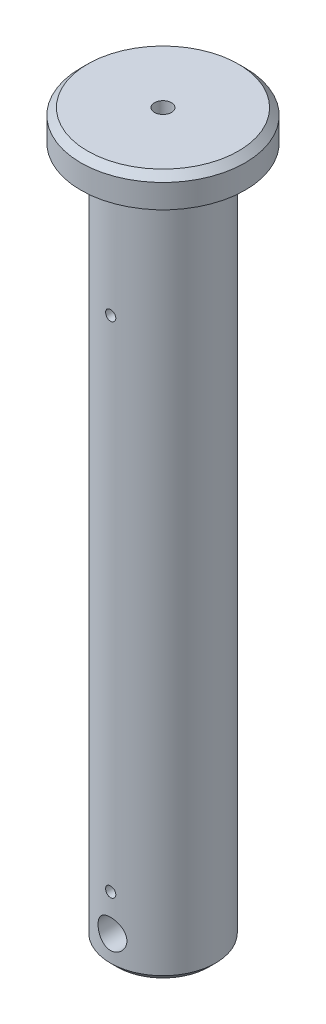
ISO-10303-21;
HEADER;
FILE_DESCRIPTION(('STEP AP214'),'2;1');
FILE_NAME('part.step','',(''),(''),'','','');
FILE_SCHEMA(('AUTOMOTIVE_DESIGN { 1 0 10303 214 1 1 1 1 }'));
ENDSEC;
DATA;
#1=APPLICATION_CONTEXT('core data for automotive mechanical design processes');
#2=APPLICATION_PROTOCOL_DEFINITION('international standard','automotive_design',2000,#1);
#3=PRODUCT_CONTEXT('',#1,'mechanical');
#4=PRODUCT('Part','Part','',(#3));
#5=PRODUCT_RELATED_PRODUCT_CATEGORY('part','',(#4));
#6=PRODUCT_DEFINITION_FORMATION('','',#4);
#7=PRODUCT_DEFINITION_CONTEXT('part definition',#1,'design');
#8=PRODUCT_DEFINITION('design','',#6,#7);
#9=PRODUCT_DEFINITION_SHAPE('','',#8);
#10=(LENGTH_UNIT() NAMED_UNIT(*) SI_UNIT(.MILLI.,.METRE.));
#11=(NAMED_UNIT(*) PLANE_ANGLE_UNIT() SI_UNIT($,.RADIAN.));
#12=(NAMED_UNIT(*) SI_UNIT($,.STERADIAN.) SOLID_ANGLE_UNIT());
#13=UNCERTAINTY_MEASURE_WITH_UNIT(LENGTH_MEASURE(1.E-05),#10,'distance_accuracy_value','');
#14=(GEOMETRIC_REPRESENTATION_CONTEXT(3) GLOBAL_UNCERTAINTY_ASSIGNED_CONTEXT((#13)) GLOBAL_UNIT_ASSIGNED_CONTEXT((#10,
#11,#12)) REPRESENTATION_CONTEXT('',''));
#15=CARTESIAN_POINT('',(0.,0.,0.));
#16=DIRECTION('',(0.,0.,1.));
#17=DIRECTION('',(1.,0.,0.));
#18=AXIS2_PLACEMENT_3D('',#15,#16,#17);
#19=CARTESIAN_POINT('',(0.,121.75,0.));
#20=DIRECTION('',(0.,1.,0.));
#21=DIRECTION('',(0.,0.,1.));
#22=AXIS2_PLACEMENT_3D('',#19,#20,#21);
#23=CYLINDRICAL_SURFACE('',#22,1.5);
#24=CARTESIAN_POINT('',(0.,81.1491393809724,0.));
#25=DIRECTION('',(0.,1.,0.));
#26=DIRECTION('',(0.,0.,1.));
#27=AXIS2_PLACEMENT_3D('',#24,#25,#26);
#28=CIRCLE('',#27,1.49999999999998);
#29=CARTESIAN_POINT('',(0.,81.1491393809724,1.49999999999996));
#30=VERTEX_POINT('',#29);
#31=EDGE_CURVE('E57',#30,#30,#28,.T.);
#32=ORIENTED_EDGE('',*,*,#31,.T.);
#33=EDGE_LOOP('',(#32));
#34=FACE_BOUND('',#33,.T.);
#35=CARTESIAN_POINT('',(0.,-80.8487090714587,0.));
#36=DIRECTION('',(0.,1.,0.));
#37=DIRECTION('',(0.,0.,1.));
#38=AXIS2_PLACEMENT_3D('',#35,#36,#37);
#39=CIRCLE('',#38,1.50000000000002);
#40=CARTESIAN_POINT('',(0.,-80.8487090714587,1.50000000000002));
#41=VERTEX_POINT('',#40);
#42=EDGE_CURVE('E11',#41,#41,#39,.T.);
#43=ORIENTED_EDGE('',*,*,#42,.F.);
#44=EDGE_LOOP('',(#43));
#45=FACE_BOUND('',#44,.T.);
#46=CARTESIAN_POINT('',(0.,45.7991393809724,0.));
#47=DIRECTION('',(0.,0.707106781186547,-0.707106781186547));
#48=DIRECTION('',(0.,0.707106781186548,0.707106781186547));
#49=AXIS2_PLACEMENT_3D('',#46,#47,#48);
#50=ELLIPSE('',#49,2.12132034355964,1.5);
#51=CARTESIAN_POINT('',(-1.5,45.7991393809724,0.));
#52=VERTEX_POINT('',#51);
#53=CARTESIAN_POINT('',(1.5,45.7991393809724,0.));
#54=VERTEX_POINT('',#53);
#55=EDGE_CURVE('E64',#52,#54,#50,.T.);
#56=ORIENTED_EDGE('',*,*,#55,.F.);
#57=CARTESIAN_POINT('',(0.,45.7991393809724,0.));
#58=DIRECTION('',(0.,0.707106781186548,0.707106781186547));
#59=DIRECTION('',(0.,0.707106781186547,-0.707106781186547));
#60=AXIS2_PLACEMENT_3D('',#57,#58,#59);
#61=ELLIPSE('',#60,2.12132034355964,1.5);
#62=EDGE_CURVE('E70',#54,#52,#61,.F.);
#63=ORIENTED_EDGE('',*,*,#62,.F.);
#64=EDGE_LOOP('',(#56,#63));
#65=FACE_BOUND('',#64,.T.);
#66=ADVANCED_FACE('F43',(#34,#45,#65),#23,.F.);
#67=CARTESIAN_POINT('',(0.,121.75,0.));
#68=DIRECTION('',(0.,1.,0.));
#69=DIRECTION('',(0.,0.,1.));
#70=AXIS2_PLACEMENT_3D('',#67,#68,#69);
#71=CYLINDRICAL_SURFACE('',#70,15.5);
#72=CARTESIAN_POINT('',(0.,-116.5,15.5));
#73=CARTESIAN_POINT('',(-0.234044001094829,-116.499994971579,15.499996731683));
#74=CARTESIAN_POINT('',(-0.468140955193609,-116.480602400803,15.4946471869299));
#75=CARTESIAN_POINT('',(-0.929575137245834,-116.403691830946,15.4738269408786));
#76=CARTESIAN_POINT('',(-1.15690933644533,-116.346157010357,15.4583517740144));
#77=CARTESIAN_POINT('',(-1.59809192774815,-116.194985204416,15.4189856764472));
#78=CARTESIAN_POINT('',(-1.81195782155556,-116.101396245842,15.3951059448869));
#79=CARTESIAN_POINT('',(-2.22095917984195,-115.880955019884,15.341445268166));
#80=CARTESIAN_POINT('',(-2.41609311354263,-115.754100037151,15.3116638413264));
#81=CARTESIAN_POINT('',(-2.78685169926927,-115.467461614464,15.2485943993305));
#82=CARTESIAN_POINT('',(-2.96195434683537,-115.307016748106,15.2152437821519));
#83=CARTESIAN_POINT('',(-3.28313469107957,-114.9591659503,15.1491903955613));
#84=CARTESIAN_POINT('',(-3.42920842010207,-114.771756339354,15.116487715258));
#85=CARTESIAN_POINT('',(-3.69077270707634,-114.371075436261,15.0547879758193));
#86=CARTESIAN_POINT('',(-3.80565486995463,-114.157393740405,15.0258696546645));
#87=CARTESIAN_POINT('',(-3.99765325734527,-113.712826175567,14.9759366632652));
#88=CARTESIAN_POINT('',(-4.07477689094871,-113.481943692028,14.954920442635));
#89=CARTESIAN_POINT('',(-4.18724098268469,-113.015327985507,14.9238188380682));
#90=CARTESIAN_POINT('',(-4.22353143606881,-112.779840676079,14.9134854022584));
#91=CARTESIAN_POINT('',(-4.25626189725561,-112.305911006215,14.9041789095926));
#92=CARTESIAN_POINT('',(-4.25270981543657,-112.067469241751,14.9052035976823));
#93=CARTESIAN_POINT('',(-4.20660848470758,-111.601879251345,14.9182760282656));
#94=CARTESIAN_POINT('',(-4.16521727684831,-111.374605693961,14.9299964173477));
#95=CARTESIAN_POINT('',(-4.04647089890425,-110.930359612354,14.9626143320436));
#96=CARTESIAN_POINT('',(-3.96911270819449,-110.713387955005,14.98351262844));
#97=CARTESIAN_POINT('',(-3.77970462779637,-110.29292667201,15.0324136439593));
#98=CARTESIAN_POINT('',(-3.6672554163267,-110.089626759404,15.0604974324522));
#99=CARTESIAN_POINT('',(-3.41113562126779,-109.704379155553,15.1205625276303));
#100=CARTESIAN_POINT('',(-3.26745857659147,-109.522435895047,15.1525446402826));
#101=CARTESIAN_POINT('',(-2.94707704301829,-109.178459863044,15.2181579180777));
#102=CARTESIAN_POINT('',(-2.76940246030864,-109.017332892946,15.251807868619));
#103=CARTESIAN_POINT('',(-2.38914055693716,-108.726970700369,15.3159763811667));
#104=CARTESIAN_POINT('',(-2.18655214052905,-108.597736881349,15.3464948053358));
#105=CARTESIAN_POINT('',(-1.76075824631216,-108.374398755695,15.4011675640127));
#106=CARTESIAN_POINT('',(-1.53745833078028,-108.280466327745,15.4252905965909));
#107=CARTESIAN_POINT('',(-1.07742212093377,-108.131740386192,15.4642286659677));
#108=CARTESIAN_POINT('',(-0.840688950295696,-108.076937813533,15.47904585709));
#109=CARTESIAN_POINT('',(-0.368229946585821,-108.009467895965,15.4973736882661));
#110=CARTESIAN_POINT('',(-0.132692392724796,-107.995569930145,15.5012144495724));
#111=CARTESIAN_POINT('',(0.337350840528517,-108.006894255135,15.4981099773144));
#112=CARTESIAN_POINT('',(0.571856630335978,-108.032112252503,15.4911659275108));
#113=CARTESIAN_POINT('',(1.02873270088103,-108.119945993203,15.4674860084727));
#114=CARTESIAN_POINT('',(1.25124658803462,-108.181868261959,15.4509318255765));
#115=CARTESIAN_POINT('',(1.68270126622545,-108.340541250161,15.4099163482131));
#116=CARTESIAN_POINT('',(1.89164054218499,-108.437295849425,15.3854541729405));
#117=CARTESIAN_POINT('',(2.29474224666484,-108.665122031209,15.3305712481264));
#118=CARTESIAN_POINT('',(2.48851602769114,-108.796853737502,15.3000390711386));
#119=CARTESIAN_POINT('',(2.85163728322288,-109.090071136275,15.2365416583241));
#120=CARTESIAN_POINT('',(3.02097963448718,-109.251563053312,15.203575914366));
#121=CARTESIAN_POINT('',(3.33566884782591,-109.605470702655,15.137700350381));
#122=CARTESIAN_POINT('',(3.48014547996119,-109.798667535728,15.1048217556789));
#123=CARTESIAN_POINT('',(3.73465585782005,-110.207265079679,15.0439202027301));
#124=CARTESIAN_POINT('',(3.84469096511805,-110.422664912361,15.0158970525529));
#125=CARTESIAN_POINT('',(4.02637194319855,-110.868539240802,14.9682048735325));
#126=CARTESIAN_POINT('',(4.09823434046443,-111.098920206716,14.9484888591061));
#127=CARTESIAN_POINT('',(4.20200511593053,-111.569134110364,14.9196551229962));
#128=CARTESIAN_POINT('',(4.23392442533741,-111.808964443552,14.9105345017253));
#129=CARTESIAN_POINT('',(4.25624818687573,-112.282332808085,14.9041761336467));
#130=CARTESIAN_POINT('',(4.24805532970033,-112.515800257737,14.9065368731631));
#131=CARTESIAN_POINT('',(4.19366154127966,-112.97788795812,14.9219296692385));
#132=CARTESIAN_POINT('',(4.14746169665383,-113.206508347237,14.9349614207134));
#133=CARTESIAN_POINT('',(4.01919971009859,-113.650533261104,14.9699820288537));
#134=CARTESIAN_POINT('',(3.93745084277997,-113.866034898325,14.9918925294361));
#135=CARTESIAN_POINT('',(3.74065386562868,-114.280430252174,15.0421999009591));
#136=CARTESIAN_POINT('',(3.62560026430372,-114.479321222959,15.0705978414262));
#137=CARTESIAN_POINT('',(3.36127670626323,-114.861505186541,15.1317789550165));
#138=CARTESIAN_POINT('',(3.21105727787171,-115.044124197332,15.1646707151057));
#139=CARTESIAN_POINT('',(2.88245093271624,-115.382017692112,15.2305453174083));
#140=CARTESIAN_POINT('',(2.70405708806336,-115.5372854307,15.2635281800583));
#141=CARTESIAN_POINT('',(2.31921438798125,-115.819592340944,15.3267768363415));
#142=CARTESIAN_POINT('',(2.1122144604156,-115.945899803058,15.3569626516391));
#143=CARTESIAN_POINT('',(1.6790946232493,-116.161726338582,15.4103247757236));
#144=CARTESIAN_POINT('',(1.45298638677701,-116.251267679043,15.4335053249301));
#145=CARTESIAN_POINT('',(1.02328619331471,-116.380116011932,15.4674539867558));
#146=CARTESIAN_POINT('',(0.82144532676328,-116.424964504273,15.4795673114937));
#147=CARTESIAN_POINT('',(0.413083039792357,-116.484907059223,15.4958413172267));
#148=CARTESIAN_POINT('',(0.206562143618003,-116.500004437975,15.5000028845455));
#149=CARTESIAN_POINT('',(0.,-116.5,15.5));
#150=B_SPLINE_CURVE_WITH_KNOTS('',3,(#72,#73,#74,#75,#76,#77,#78,#79,#80,#81,#82,#83,#84,#85,
#86,#87,#88,#89,#90,#91,#92,#93,#94,#95,#96,#97,#98,#99,#100,#101,#102,#103,#104,#105,#106,#107,
#108,#109,#110,#111,#112,#113,#114,#115,#116,#117,#118,#119,#120,#121,#122,#123,#124,#125,#126,
#127,#128,#129,#130,#131,#132,#133,#134,#135,#136,#137,#138,#139,#140,#141,#142,#143,#144,#145,
#146,#147,#148,#149),.UNSPECIFIED.,.T.,.F.,(4,2,2,2,2,2,2,2,2,2,2,2,2,2,2,2,2,2,2,2,2,2,2,2,2,2,
2,2,2,2,2,2,2,2,2,2,2,2,4),(0.,0.701374224424726,1.40305797510329,2.10381024516221,
2.80461973212784,3.52080598898644,4.23709006654046,4.96647824341193,5.69572324014229,
6.40762671701645,7.11938885433779,7.81007170937727,8.50081258070493,9.19971956028484,
9.89877128269117,10.6219904743086,11.3452414855307,12.0719696590743,12.7985295312965,
13.5029953113035,14.2073837733063,14.8988699682275,15.590433208589,16.2961116879339,
17.0019379327788,17.7288967373787,18.4558267995356,19.1785882449314,19.9011518492435,
20.5986322210377,21.2960926525672,21.9875274908931,22.6790764023118,23.3920462535982,
24.1051916928481,24.8347458454454,25.563857496486,26.1829441372441,26.8019617689624),.UNSPECIFIED.);
#151=CARTESIAN_POINT('',(0.,-116.5,15.5));
#152=VERTEX_POINT('',#151);
#153=EDGE_CURVE('E47',#152,#152,#150,.T.);
#154=ORIENTED_EDGE('',*,*,#153,.T.);
#155=EDGE_LOOP('',(#154));
#156=FACE_BOUND('',#155,.T.);
#157=CARTESIAN_POINT('',(4.25,-112.25,-14.9059551857638));
#158=CARTESIAN_POINT('',(4.24999488522442,-112.016142568574,-14.9059589746067));
#159=CARTESIAN_POINT('',(4.23063214644481,-111.782232027662,-14.9115188036944));
#160=CARTESIAN_POINT('',(4.15385079292532,-111.321184325275,-14.933086165905));
#161=CARTESIAN_POINT('',(4.09641450051364,-111.094050361403,-14.9490985521307));
#162=CARTESIAN_POINT('',(3.94553055670862,-110.653292777647,-14.9896241970184));
#163=CARTESIAN_POINT('',(3.85213551620893,-110.439649948112,-15.0141250310941));
#164=CARTESIAN_POINT('',(3.63215195534969,-110.031027398197,-15.0688509028496));
#165=CARTESIAN_POINT('',(3.50556032035812,-109.83604943137,-15.0990764775727));
#166=CARTESIAN_POINT('',(3.21919692306056,-109.465136238755,-15.1627418652733));
#167=CARTESIAN_POINT('',(3.05870439202164,-109.289767585312,-15.1962412382274));
#168=CARTESIAN_POINT('',(2.71064396300685,-108.9680677613,-15.2621667890379));
#169=CARTESIAN_POINT('',(2.52307312461682,-108.821739748336,-15.2945928498733));
#170=CARTESIAN_POINT('',(2.12222978962299,-108.559891302548,-15.3553854582037));
#171=CARTESIAN_POINT('',(1.9085743727651,-108.444937257844,-15.3836735693965));
#172=CARTESIAN_POINT('',(1.46406257328754,-108.252798965524,-15.4323177349872));
#173=CARTESIAN_POINT('',(1.23320927244565,-108.175607969622,-15.4526752064641));
#174=CARTESIAN_POINT('',(0.766771757966199,-108.063029534185,-15.4827431563299));
#175=CARTESIAN_POINT('',(0.531436426250144,-108.026677578576,-15.4926988815174));
#176=CARTESIAN_POINT('',(0.057810937630886,-107.993771280495,-15.5017004118799));
#177=CARTESIAN_POINT('',(-0.180478690084375,-107.997209910553,-15.5007481435306));
#178=CARTESIAN_POINT('',(-0.646523777582161,-108.043114812403,-15.4882193102903));
#179=CARTESIAN_POINT('',(-0.874390731987512,-108.084538513778,-15.4769265705426));
#180=CARTESIAN_POINT('',(-1.31980593378543,-108.20354934633,-15.4453227170116));
#181=CARTESIAN_POINT('',(-1.53735357567812,-108.281138596686,-15.4250110747544));
#182=CARTESIAN_POINT('',(-1.95857637040681,-108.471056574577,-15.3772368866857));
#183=CARTESIAN_POINT('',(-2.16208489172742,-108.583736087884,-15.3497025975388));
#184=CARTESIAN_POINT('',(-2.54765573900489,-108.840365156417,-15.2904400787306));
#185=CARTESIAN_POINT('',(-2.72971366804827,-108.984321105505,-15.2587109920439));
#186=CARTESIAN_POINT('',(-3.07343931000042,-109.30492442466,-15.1932749745252));
#187=CARTESIAN_POINT('',(-3.23425504529121,-109.482480035413,-15.1595372699986));
#188=CARTESIAN_POINT('',(-3.52404291190807,-109.862385754696,-15.0948080169217));
#189=CARTESIAN_POINT('',(-3.6530128647999,-110.064737558011,-15.0638166563299));
#190=CARTESIAN_POINT('',(-3.87614695434802,-110.490423427954,-15.0079600434263));
#191=CARTESIAN_POINT('',(-3.97006688744778,-110.713891594839,-14.9831381611681));
#192=CARTESIAN_POINT('',(-4.11871871775667,-111.174299175687,-14.9429632788265));
#193=CARTESIAN_POINT('',(-4.17346097759179,-111.411235009496,-14.9276077750034));
#194=CARTESIAN_POINT('',(-4.24070836537975,-111.883853307174,-14.9086412339289));
#195=CARTESIAN_POINT('',(-4.2544896602924,-112.119340147216,-14.9046754782247));
#196=CARTESIAN_POINT('',(-4.24295040309154,-112.589256046558,-14.9079646659928));
#197=CARTESIAN_POINT('',(-4.21763428537876,-112.823685222793,-14.9152183369659));
#198=CARTESIAN_POINT('',(-4.12974654456128,-113.279828330344,-14.9397852018906));
#199=CARTESIAN_POINT('',(-4.06795367751815,-113.50170475715,-14.9568879428801));
#200=CARTESIAN_POINT('',(-3.90974796893045,-113.931940832444,-14.9990175933463));
#201=CARTESIAN_POINT('',(-3.81333041800276,-114.140298637679,-15.0240455806992));
#202=CARTESIAN_POINT('',(-3.58605876975781,-114.542890051029,-15.0799249947056));
#203=CARTESIAN_POINT('',(-3.45446167916886,-114.736687033127,-15.1108974254731));
#204=CARTESIAN_POINT('',(-3.16147897621474,-115.09991574884,-15.1748967565304));
#205=CARTESIAN_POINT('',(-3.00008743196617,-115.269342618551,-15.2079240650634));
#206=CARTESIAN_POINT('',(-2.64617301921004,-115.584380183986,-15.2735419232602));
#207=CARTESIAN_POINT('',(-2.45284504731041,-115.729097648866,-15.3060877641918));
#208=CARTESIAN_POINT('',(-2.04390471018056,-115.984032158647,-15.3660370665979));
#209=CARTESIAN_POINT('',(-1.82829353031726,-116.094251037464,-15.3934408013913));
#210=CARTESIAN_POINT('',(-1.38242251921243,-116.276028888818,-15.4398416416358));
#211=CARTESIAN_POINT('',(-1.15228833379478,-116.347879146846,-15.4589018834113));
#212=CARTESIAN_POINT('',(-0.68260811859772,-116.451708494934,-15.4867465190554));
#213=CARTESIAN_POINT('',(-0.443064317210368,-116.483696967067,-15.4955333309009));
#214=CARTESIAN_POINT('',(0.0303110813249544,-116.506279155874,-15.5017196678931));
#215=CARTESIAN_POINT('',(0.264076498197161,-116.498179649014,-15.4994786878097));
#216=CARTESIAN_POINT('',(0.726785748202857,-116.443869391891,-15.4846816527614));
#217=CARTESIAN_POINT('',(0.955729780771841,-116.397660221214,-15.4721260253226));
#218=CARTESIAN_POINT('',(1.40063034563142,-116.269197794442,-15.4381889050738));
#219=CARTESIAN_POINT('',(1.61667285445488,-116.187223059442,-15.4168756844443));
#220=CARTESIAN_POINT('',(2.03205974292101,-115.989804388658,-15.3676455958709));
#221=CARTESIAN_POINT('',(2.23140167519126,-115.874355558461,-15.3397277623435));
#222=CARTESIAN_POINT('',(2.61375767900484,-115.609516701582,-15.2792934706519));
#223=CARTESIAN_POINT('',(2.79616151720711,-115.459270066712,-15.2466704959798));
#224=CARTESIAN_POINT('',(3.13360889027573,-115.130707184702,-15.180912762456));
#225=CARTESIAN_POINT('',(3.28864507418654,-114.952383420301,-15.1477778686939));
#226=CARTESIAN_POINT('',(3.5705945393854,-114.567662657884,-15.0838420957925));
#227=CARTESIAN_POINT('',(3.69675701088006,-114.360702029175,-15.0531148378429));
#228=CARTESIAN_POINT('',(3.91232224262959,-113.927689845325,-14.9985392398652));
#229=CARTESIAN_POINT('',(4.00174772672291,-113.701650196238,-14.9746866502117));
#230=CARTESIAN_POINT('',(4.130366453834,-113.272224855967,-14.9396718733312));
#231=CARTESIAN_POINT('',(4.17511996078346,-113.070600355751,-14.9271339479147));
#232=CARTESIAN_POINT('',(4.23493706424274,-112.662663946321,-14.910274465581));
#233=CARTESIAN_POINT('',(4.25000451320911,-112.456352648842,-14.9059518425399));
#234=CARTESIAN_POINT('',(4.25,-112.25,-14.9059551857638));
#235=B_SPLINE_CURVE_WITH_KNOTS('',3,(#157,#158,#159,#160,#161,#162,#163,#164,#165,#166,#167,
#168,#169,#170,#171,#172,#173,#174,#175,#176,#177,#178,#179,#180,#181,#182,#183,#184,#185,#186,
#187,#188,#189,#190,#191,#192,#193,#194,#195,#196,#197,#198,#199,#200,#201,#202,#203,#204,#205,
#206,#207,#208,#209,#210,#211,#212,#213,#214,#215,#216,#217,#218,#219,#220,#221,#222,#223,#224,
#225,#226,#227,#228,#229,#230,#231,#232,#233,#234),.UNSPECIFIED.,.T.,.F.,(4,2,2,2,2,2,2,2,2,2,2,
2,2,2,2,2,2,2,2,2,2,2,2,2,2,2,2,2,2,2,2,2,2,2,2,2,2,2,4),(0.,0.700813005442095,1.40195162871364,
2.10206829737107,2.80225067718094,3.51916932831061,4.23616588776729,4.96535881153612,
5.6944213803148,6.40587747651871,7.11720792342215,7.80958065973359,8.50199397184189,
9.20156422715699,9.90127763088444,10.6236664765061,11.3461047239884,12.0734863818195,
12.8006755735845,13.5049580187297,14.2091605905273,14.8988464856265,15.588626222046,
16.2943159100148,17.0001462480639,17.7276948828281,18.4552048351627,19.1771102232133,
19.8988456678026,20.5972121802511,21.2955497479553,21.98854352139,22.6816386720414,
23.3940589625465,24.1066703190278,24.8361145903639,25.5651069786263,26.183575204833,
26.8019631651136),.UNSPECIFIED.);
#236=CARTESIAN_POINT('',(4.25,-112.25,-14.9059551857638));
#237=VERTEX_POINT('',#236);
#238=EDGE_CURVE('E197',#237,#237,#235,.T.);
#239=ORIENTED_EDGE('',*,*,#238,.T.);
#240=EDGE_LOOP('',(#239));
#241=FACE_BOUND('',#240,.T.);
#242=CARTESIAN_POINT('',(0.,82.1491393809724,0.));
#243=DIRECTION('',(0.,1.,0.));
#244=DIRECTION('',(0.,0.,1.));
#245=AXIS2_PLACEMENT_3D('',#242,#243,#244);
#246=CIRCLE('',#245,15.5);
#247=CARTESIAN_POINT('',(0.,82.1491393809724,15.5));
#248=VERTEX_POINT('',#247);
#249=EDGE_CURVE('E84',#248,#248,#246,.T.);
#250=ORIENTED_EDGE('',*,*,#249,.F.);
#251=EDGE_LOOP('',(#250));
#252=FACE_BOUND('',#251,.T.);
#253=CARTESIAN_POINT('',(0.,-119.75,0.));
#254=DIRECTION('',(0.,1.,0.));
#255=DIRECTION('',(0.,0.,1.));
#256=AXIS2_PLACEMENT_3D('',#253,#254,#255);
#257=CIRCLE('',#256,15.5);
#258=CARTESIAN_POINT('',(0.,-119.75,15.5));
#259=VERTEX_POINT('',#258);
#260=EDGE_CURVE('E78',#259,#259,#257,.T.);
#261=ORIENTED_EDGE('',*,*,#260,.T.);
#262=EDGE_LOOP('',(#261));
#263=FACE_BOUND('',#262,.T.);
#264=CARTESIAN_POINT('',(0.,-103.000860619028,15.5));
#265=CARTESIAN_POINT('',(0.0840447690969777,-103.000856972692,15.4999990608434));
#266=CARTESIAN_POINT('',(0.16814544681986,-102.993773318844,15.4993091648267));
#267=CARTESIAN_POINT('',(0.334016180007088,-102.965621620877,15.4966233706548));
#268=CARTESIAN_POINT('',(0.415783547817349,-102.944538079222,15.4946260252196));
#269=CARTESIAN_POINT('',(0.574561600756704,-102.889005274097,15.4895508476217));
#270=CARTESIAN_POINT('',(0.651575089487799,-102.854563977372,15.4864736595958));
#271=CARTESIAN_POINT('',(0.79871089705281,-102.773308542877,15.4795830889513));
#272=CARTESIAN_POINT('',(0.868834603767822,-102.726496904035,15.475769855063));
#273=CARTESIAN_POINT('',(1.00045451919381,-102.621659552802,15.4678200830685));
#274=CARTESIAN_POINT('',(1.06192417415579,-102.563600570994,15.4636826080361));
#275=CARTESIAN_POINT('',(1.17426293628707,-102.437987464405,15.4555584437014));
#276=CARTESIAN_POINT('',(1.22513155839086,-102.370432905377,15.4515717613057));
#277=CARTESIAN_POINT('',(1.31491755212317,-102.227581082374,15.4441909021226));
#278=CARTESIAN_POINT('',(1.35381102463955,-102.152268730412,15.4407979159382));
#279=CARTESIAN_POINT('',(1.41839006331875,-101.996143890685,15.4350000678627));
#280=CARTESIAN_POINT('',(1.44407593638039,-101.91533153077,15.4325951830119));
#281=CARTESIAN_POINT('',(1.48143224301419,-101.75077059449,15.4290541875632));
#282=CARTESIAN_POINT('',(1.49314657620139,-101.667032070522,15.4279141036597));
#283=CARTESIAN_POINT('',(1.50236296103202,-101.498770282716,15.4270194179989));
#284=CARTESIAN_POINT('',(1.49986536400149,-101.414247038329,15.4272647819927));
#285=CARTESIAN_POINT('',(1.48076498894704,-101.247117359688,15.4291096439892));
#286=CARTESIAN_POINT('',(1.46421009692311,-101.164505394922,15.4307045447473));
#287=CARTESIAN_POINT('',(1.41753955044753,-101.003238043737,15.4350615883058));
#288=CARTESIAN_POINT('',(1.38742372328913,-100.924582707722,15.4378237459717));
#289=CARTESIAN_POINT('',(1.3144331701195,-100.773309803915,15.4442093689107));
#290=CARTESIAN_POINT('',(1.27153714916035,-100.700702574188,15.447834269682));
#291=CARTESIAN_POINT('',(1.17421918083192,-100.563700047629,15.4555357080413));
#292=CARTESIAN_POINT('',(1.11979691766072,-100.499304975876,15.4596122580023));
#293=CARTESIAN_POINT('',(1.0007036248339,-100.380276406412,15.467778149849));
#294=CARTESIAN_POINT('',(0.935991230844075,-100.325684285833,15.4718674751061));
#295=CARTESIAN_POINT('',(0.798298397116558,-100.228131830215,15.4795822403683));
#296=CARTESIAN_POINT('',(0.725317948977992,-100.185171506995,15.4832076799019));
#297=CARTESIAN_POINT('',(0.573132354004567,-100.112103981784,15.4895872667712));
#298=CARTESIAN_POINT('',(0.49392621964818,-100.081998823776,15.4923412755305));
#299=CARTESIAN_POINT('',(0.33155089688371,-100.035526247215,15.4966662518374));
#300=CARTESIAN_POINT('',(0.248381819516206,-100.019158443983,15.4982372525119));
#301=CARTESIAN_POINT('',(0.0807998699658618,-100.000677563252,15.5000149488749));
#302=CARTESIAN_POINT('',(-0.00360664872415159,-99.9985073769215,15.5002271103181));
#303=CARTESIAN_POINT('',(-0.171582223432719,-100.008333419601,15.4992778673279));
#304=CARTESIAN_POINT('',(-0.255151290021928,-100.020329469571,15.4981164802541));
#305=CARTESIAN_POINT('',(-0.418915323440387,-100.058100092001,15.4945541728126));
#306=CARTESIAN_POINT('',(-0.499116501285824,-100.083847980605,15.4921556532656));
#307=CARTESIAN_POINT('',(-0.654061065166426,-100.148364004849,15.4863882360456));
#308=CARTESIAN_POINT('',(-0.728804336181193,-100.187132414788,15.4830193179298));
#309=CARTESIAN_POINT('',(-0.870969956952317,-100.276731009899,15.4756744902326));
#310=CARTESIAN_POINT('',(-0.938368519861878,-100.327598781178,15.4716967032363));
#311=CARTESIAN_POINT('',(-1.063690883411,-100.439898174093,15.4635866824089));
#312=CARTESIAN_POINT('',(-1.12161446149985,-100.501330043791,15.4594544449528));
#313=CARTESIAN_POINT('',(-1.2265404104347,-100.63326271031,15.4514848611242));
#314=CARTESIAN_POINT('',(-1.27350534472493,-100.70379335204,15.4476485547295));
#315=CARTESIAN_POINT('',(-1.35492362684182,-100.851773972548,15.4407207960368));
#316=CARTESIAN_POINT('',(-1.38937713632824,-100.929223861905,15.437629334115));
#317=CARTESIAN_POINT('',(-1.44473165924376,-101.088715207645,15.4325476546678));
#318=CARTESIAN_POINT('',(-1.46565508048988,-101.170748826579,15.4305556171399));
#319=CARTESIAN_POINT('',(-1.49342824592435,-101.337185142138,15.4278925920678));
#320=CARTESIAN_POINT('',(-1.50027836587078,-101.421587775448,15.4272215692524));
#321=CARTESIAN_POINT('',(-1.49970544838814,-101.589994160152,15.4272772456337));
#322=CARTESIAN_POINT('',(-1.49234122101485,-101.673998119726,15.4279981857641));
#323=CARTESIAN_POINT('',(-1.46367181971076,-101.839569680358,15.4307442855974));
#324=CARTESIAN_POINT('',(-1.44236662881246,-101.92113727845,15.4327694468876));
#325=CARTESIAN_POINT('',(-1.38643603648423,-102.079521135227,15.4378942240177));
#326=CARTESIAN_POINT('',(-1.35181222712909,-102.156337960533,15.4409937114308));
#327=CARTESIAN_POINT('',(-1.27023339108404,-102.30307898514,15.4479181630127));
#328=CARTESIAN_POINT('',(-1.2232784591348,-102.373003237391,15.4517431216076));
#329=CARTESIAN_POINT('',(-1.11814927354608,-102.504275593857,15.4597064748509));
#330=CARTESIAN_POINT('',(-1.05993123351073,-102.5655885607,15.4638460531836));
#331=CARTESIAN_POINT('',(-0.934013970477155,-102.677601509041,15.4719613957829));
#332=CARTESIAN_POINT('',(-0.866312475176046,-102.728298939698,15.4759371204926));
#333=CARTESIAN_POINT('',(-0.723175504142434,-102.817735175484,15.4832865127796));
#334=CARTESIAN_POINT('',(-0.647722009804922,-102.856445239782,15.4866587253412));
#335=CARTESIAN_POINT('',(-0.491402285768983,-102.920595054831,15.4924051065115));
#336=CARTESIAN_POINT('',(-0.410542301434929,-102.946049828635,15.494780404391));
#337=CARTESIAN_POINT('',(-0.274350403674449,-102.976591057666,15.4976657933468));
#338=CARTESIAN_POINT('',(-0.219890232894766,-102.985679778741,15.4985370592703));
#339=CARTESIAN_POINT('',(-0.110294733773434,-102.997815744498,15.4997044696923));
#340=CARTESIAN_POINT('',(-0.0551594079999106,-103.000863012154,15.5000006163777));
#341=CARTESIAN_POINT('',(0.,-103.000860619028,15.5));
#342=B_SPLINE_CURVE_WITH_KNOTS('',3,(#264,#265,#266,#267,#268,#269,#270,#271,#272,#273,#274,
#275,#276,#277,#278,#279,#280,#281,#282,#283,#284,#285,#286,#287,#288,#289,#290,#291,#292,#293,
#294,#295,#296,#297,#298,#299,#300,#301,#302,#303,#304,#305,#306,#307,#308,#309,#310,#311,#312,
#313,#314,#315,#316,#317,#318,#319,#320,#321,#322,#323,#324,#325,#326,#327,#328,#329,#330,#331,
#332,#333,#334,#335,#336,#337,#338,#339,#340,#341),.UNSPECIFIED.,.T.,.F.,(4,2,2,2,2,2,2,2,2,2,2,
2,2,2,2,2,2,2,2,2,2,2,2,2,2,2,2,2,2,2,2,2,2,2,2,2,2,2,4),(0.,0.251932891918655,
0.504145133393507,0.756207182812507,1.00821835217502,1.26098667302991,1.51376655712491,
1.76704769857862,2.02032295439099,2.27280028621975,2.5252713767093,2.77688586197554,
3.02850355179605,3.28054286595887,3.53258908651826,3.78567536299102,4.03876189661786,
4.29188865628947,4.54500832758452,4.79710921500211,5.04920691628328,5.30081721882179,
5.55243282228816,5.80484050805848,6.05725412159003,6.31051779450615,6.56377819489285,
6.81661807721737,7.06945120861253,7.32124051695734,7.57303013175463,7.8247896575912,
8.07654724920248,8.32930398748325,8.582121391989,8.83554033886798,9.0886714415519,
9.25401810340625,9.41936413651753),.UNSPECIFIED.);
#343=CARTESIAN_POINT('',(0.,-103.000860619028,15.5));
#344=VERTEX_POINT('',#343);
#345=EDGE_CURVE('E104',#344,#344,#342,.T.);
#346=ORIENTED_EDGE('',*,*,#345,.F.);
#347=EDGE_LOOP('',(#346));
#348=FACE_BOUND('',#347,.T.);
#349=CARTESIAN_POINT('',(0.,44.2991393809724,15.5));
#350=CARTESIAN_POINT('',(0.0840447690969791,44.2991430273081,15.4999990608434));
#351=CARTESIAN_POINT('',(0.168145446819864,44.3062266811565,15.4993091648267));
#352=CARTESIAN_POINT('',(0.334016180007091,44.3343783791234,15.4966233706548));
#353=CARTESIAN_POINT('',(0.415783547817349,44.3554619207778,15.4946260252195));
#354=CARTESIAN_POINT('',(0.574561600756701,44.4109947259034,15.4895508476217));
#355=CARTESIAN_POINT('',(0.651575089487797,44.4454360226283,15.4864736595958));
#356=CARTESIAN_POINT('',(0.798710897052807,44.5266914571225,15.4795830889513));
#357=CARTESIAN_POINT('',(0.868834603767817,44.5735030959652,15.475769855063));
#358=CARTESIAN_POINT('',(1.0004545191938,44.6783404471981,15.4678200830684));
#359=CARTESIAN_POINT('',(1.06192417415578,44.7363994290058,15.463682608036));
#360=CARTESIAN_POINT('',(1.17426293628706,44.8620125355946,15.4555584437014));
#361=CARTESIAN_POINT('',(1.22513155839085,44.9295670946229,15.4515717613057));
#362=CARTESIAN_POINT('',(1.31491755212316,45.0724189176257,15.4441909021226));
#363=CARTESIAN_POINT('',(1.35381102463954,45.1477312695879,15.4407979159382));
#364=CARTESIAN_POINT('',(1.41839006331874,45.3038561093154,15.4350000678627));
#365=CARTESIAN_POINT('',(1.44407593638038,45.3846684692301,15.4325951830119));
#366=CARTESIAN_POINT('',(1.48143224301418,45.54922940551,15.4290541875632));
#367=CARTESIAN_POINT('',(1.49314657620138,45.6329679294781,15.4279141036597));
#368=CARTESIAN_POINT('',(1.502362961032,45.8012297172836,15.4270194179989));
#369=CARTESIAN_POINT('',(1.49986536400147,45.8857529616708,15.4272647819926));
#370=CARTESIAN_POINT('',(1.48076498894702,46.0528826403121,15.4291096439892));
#371=CARTESIAN_POINT('',(1.46421009692309,46.1354946050781,15.4307045447473));
#372=CARTESIAN_POINT('',(1.41753955044752,46.2967619562633,15.4350615883057));
#373=CARTESIAN_POINT('',(1.38742372328911,46.3754172922783,15.4378237459717));
#374=CARTESIAN_POINT('',(1.31443317011948,46.5266901960846,15.4442093689106));
#375=CARTESIAN_POINT('',(1.27153714916033,46.5992974258118,15.447834269682));
#376=CARTESIAN_POINT('',(1.1742191808319,46.7362999523706,15.4555357080413));
#377=CARTESIAN_POINT('',(1.1197969176607,46.8006950241238,15.4596122580023));
#378=CARTESIAN_POINT('',(1.00070362483387,46.9197235935877,15.467778149849));
#379=CARTESIAN_POINT('',(0.935991230844047,46.974315714167,15.4718674751061));
#380=CARTESIAN_POINT('',(0.798298397116525,47.071868169785,15.4795822403682));
#381=CARTESIAN_POINT('',(0.725317948977957,47.1148284930048,15.4832076799019));
#382=CARTESIAN_POINT('',(0.573132354004532,47.1878960182164,15.4895872667712));
#383=CARTESIAN_POINT('',(0.493926219648147,47.218001176224,15.4923412755305));
#384=CARTESIAN_POINT('',(0.331550896883683,47.2644737527851,15.4966662518374));
#385=CARTESIAN_POINT('',(0.248381819516181,47.2808415560167,15.4982372525118));
#386=CARTESIAN_POINT('',(0.0807998699658377,47.2993224367483,15.5000149488749));
#387=CARTESIAN_POINT('',(-0.00360664872417641,47.3014926230785,15.500227110318));
#388=CARTESIAN_POINT('',(-0.171582223432745,47.2916665803992,15.4992778673279));
#389=CARTESIAN_POINT('',(-0.255151290021955,47.2796705304292,15.4981164802541));
#390=CARTESIAN_POINT('',(-0.418915323440414,47.2418999079995,15.4945541728126));
#391=CARTESIAN_POINT('',(-0.499116501285849,47.2161520193954,15.4921556532656));
#392=CARTESIAN_POINT('',(-0.65406106516645,47.1516359951513,15.4863882360456));
#393=CARTESIAN_POINT('',(-0.728804336181216,47.112867585212,15.4830193179298));
#394=CARTESIAN_POINT('',(-0.87096995695234,47.0232689901009,15.4756744902326));
#395=CARTESIAN_POINT('',(-0.938368519861902,46.9724012188217,15.4716967032363));
#396=CARTESIAN_POINT('',(-1.06369088341103,46.860101825907,15.4635866824089));
#397=CARTESIAN_POINT('',(-1.12161446149987,46.798669956209,15.4594544449528));
#398=CARTESIAN_POINT('',(-1.22654041043472,46.6667372896902,15.4514848611242));
#399=CARTESIAN_POINT('',(-1.27350534472495,46.5962066479595,15.4476485547294));
#400=CARTESIAN_POINT('',(-1.35492362684184,46.4482260274522,15.4407207960368));
#401=CARTESIAN_POINT('',(-1.38937713632826,46.3707761380951,15.437629334115));
#402=CARTESIAN_POINT('',(-1.44473165924378,46.2112847923554,15.4325476546678));
#403=CARTESIAN_POINT('',(-1.4656550804899,46.1292511734205,15.4305556171399));
#404=CARTESIAN_POINT('',(-1.49342824592437,45.9628148578618,15.4278925920678));
#405=CARTESIAN_POINT('',(-1.5002783658708,45.8784122245517,15.4272215692524));
#406=CARTESIAN_POINT('',(-1.49970544838816,45.7100058398482,15.4272772456337));
#407=CARTESIAN_POINT('',(-1.49234122101486,45.6260018802741,15.4279981857641));
#408=CARTESIAN_POINT('',(-1.46367181971077,45.4604303196422,15.4307442855974));
#409=CARTESIAN_POINT('',(-1.44236662881247,45.3788627215498,15.4327694468876));
#410=CARTESIAN_POINT('',(-1.38643603648425,45.2204788647733,15.4378942240177));
#411=CARTESIAN_POINT('',(-1.3518122271291,45.1436620394671,15.4409937114308));
#412=CARTESIAN_POINT('',(-1.27023339108404,44.9969210148601,15.4479181630127));
#413=CARTESIAN_POINT('',(-1.22327845913481,44.9269967626091,15.4517431216076));
#414=CARTESIAN_POINT('',(-1.11814927354608,44.7957244061426,15.4597064748509));
#415=CARTESIAN_POINT('',(-1.05993123351073,44.7344114392996,15.4638460531836));
#416=CARTESIAN_POINT('',(-0.93401397047716,44.6223984909585,15.4719613957829));
#417=CARTESIAN_POINT('',(-0.866312475176054,44.5717010603024,15.4759371204926));
#418=CARTESIAN_POINT('',(-0.723175504142444,44.4822648245165,15.4832865127796));
#419=CARTESIAN_POINT('',(-0.647722009804931,44.4435547602178,15.4866587253412));
#420=CARTESIAN_POINT('',(-0.49140228576899,44.3794049451691,15.4924051065115));
#421=CARTESIAN_POINT('',(-0.410542301434934,44.3539501713646,15.4947804043909));
#422=CARTESIAN_POINT('',(-0.274350403674451,44.3234089423341,15.4976657933468));
#423=CARTESIAN_POINT('',(-0.219890232894768,44.3143202212589,15.4985370592703));
#424=CARTESIAN_POINT('',(-0.110294733773436,44.3021842555016,15.4997044696923));
#425=CARTESIAN_POINT('',(-0.0551594079999119,44.2991369878465,15.5000006163777));
#426=CARTESIAN_POINT('',(0.,44.2991393809724,15.5));
#427=B_SPLINE_CURVE_WITH_KNOTS('',3,(#349,#350,#351,#352,#353,#354,#355,#356,#357,#358,#359,
#360,#361,#362,#363,#364,#365,#366,#367,#368,#369,#370,#371,#372,#373,#374,#375,#376,#377,#378,
#379,#380,#381,#382,#383,#384,#385,#386,#387,#388,#389,#390,#391,#392,#393,#394,#395,#396,#397,
#398,#399,#400,#401,#402,#403,#404,#405,#406,#407,#408,#409,#410,#411,#412,#413,#414,#415,#416,
#417,#418,#419,#420,#421,#422,#423,#424,#425,#426),.UNSPECIFIED.,.T.,.F.,(4,2,2,2,2,2,2,2,2,2,2,
2,2,2,2,2,2,2,2,2,2,2,2,2,2,2,2,2,2,2,2,2,2,2,2,2,2,2,4),(0.,0.251932891918656,
0.504145133393503,0.756207182812504,1.00821835217501,1.2609866730299,1.5137665571249,
1.76704769857861,2.02032295439098,2.27280028621974,2.5252713767093,2.77688586197554,
3.02850355179604,3.28054286595886,3.53258908651825,3.78567536299102,4.03876189661787,
4.29188865628947,4.54500832758451,4.7971092150021,5.04920691628327,5.30081721882178,
5.55243282228815,5.80484050805847,6.05725412159004,6.31051779450614,6.56377819489285,
6.81661807721736,7.06945120861253,7.32124051695735,7.57303013175463,7.8247896575912,
8.07654724920249,8.32930398748326,8.58212139198898,8.83554033886797,9.0886714415519,
9.25401810340625,9.41936413651753),.UNSPECIFIED.);
#428=CARTESIAN_POINT('',(0.,44.2991393809724,15.5));
#429=VERTEX_POINT('',#428);
#430=EDGE_CURVE('E73',#429,#429,#427,.T.);
#431=ORIENTED_EDGE('',*,*,#430,.F.);
#432=EDGE_LOOP('',(#431));
#433=FACE_BOUND('',#432,.T.);
#434=ADVANCED_FACE('F116',(#156,#241,#252,#263,#348,#433),#71,.T.);
#435=CARTESIAN_POINT('',(0.,-80.8487090714587,0.));
#436=DIRECTION('',(0.,1.,0.));
#437=DIRECTION('',(0.,0.,1.));
#438=AXIS2_PLACEMENT_3D('',#435,#436,#437);
#439=CONICAL_SURFACE('',#438,1.50000000000002,1.02974425867666);
#440=CARTESIAN_POINT('',(0.,-81.75,0.));
#441=VERTEX_POINT('',#440);
#442=VERTEX_LOOP('',#441);
#443=FACE_BOUND('',#442,.T.);
#444=ORIENTED_EDGE('',*,*,#42,.T.);
#445=EDGE_LOOP('',(#444));
#446=FACE_BOUND('',#445,.T.);
#447=ADVANCED_FACE('F45',(#443,#446),#439,.F.);
#448=CARTESIAN_POINT('',(0.,81.75,0.));
#449=DIRECTION('',(0.,1.,0.));
#450=DIRECTION('',(0.,0.,1.));
#451=AXIS2_PLACEMENT_3D('',#448,#449,#450);
#452=CONICAL_SURFACE('',#451,2.49999999999998,1.02974425867665);
#453=ORIENTED_EDGE('',*,*,#31,.F.);
#454=EDGE_LOOP('',(#453));
#455=FACE_BOUND('',#454,.T.);
#456=CARTESIAN_POINT('',(0.,81.75,0.));
#457=DIRECTION('',(0.,1.,0.));
#458=DIRECTION('',(0.,0.,1.));
#459=AXIS2_PLACEMENT_3D('',#456,#457,#458);
#460=CIRCLE('',#459,2.49999999999998);
#461=CARTESIAN_POINT('',(0.,81.75,2.49999999999996));
#462=VERTEX_POINT('',#461);
#463=EDGE_CURVE('E99',#462,#462,#460,.T.);
#464=ORIENTED_EDGE('',*,*,#463,.T.);
#465=EDGE_LOOP('',(#464));
#466=FACE_BOUND('',#465,.T.);
#467=ADVANCED_FACE('F152',(#455,#466),#452,.F.);
#468=CARTESIAN_POINT('',(0.,121.75,0.));
#469=DIRECTION('',(0.,1.,0.));
#470=DIRECTION('',(0.,0.,1.));
#471=AXIS2_PLACEMENT_3D('',#468,#469,#470);
#472=CYLINDRICAL_SURFACE('',#471,2.49999999999998);
#473=ORIENTED_EDGE('',*,*,#463,.F.);
#474=EDGE_LOOP('',(#473));
#475=FACE_BOUND('',#474,.T.);
#476=CARTESIAN_POINT('',(0.,91.1491393809724,0.));
#477=DIRECTION('',(0.,1.,0.));
#478=DIRECTION('',(0.,0.,1.));
#479=AXIS2_PLACEMENT_3D('',#476,#477,#478);
#480=CIRCLE('',#479,2.49999999999998);
#481=CARTESIAN_POINT('',(0.,91.1491393809724,2.49999999999995));
#482=VERTEX_POINT('',#481);
#483=EDGE_CURVE('E96',#482,#482,#480,.T.);
#484=ORIENTED_EDGE('',*,*,#483,.T.);
#485=EDGE_LOOP('',(#484));
#486=FACE_BOUND('',#485,.T.);
#487=ADVANCED_FACE('F155',(#475,#486),#472,.F.);
#488=CARTESIAN_POINT('',(0.,91.1491393809724,-2.5));
#489=DIRECTION('',(0.,-1.,0.));
#490=DIRECTION('',(0.,0.,-1.));
#491=AXIS2_PLACEMENT_3D('',#488,#489,#490);
#492=PLANE('',#491);
#493=ORIENTED_EDGE('',*,*,#483,.F.);
#494=EDGE_LOOP('',(#493));
#495=FACE_BOUND('',#494,.T.);
#496=CARTESIAN_POINT('',(0.,91.1491393809724,0.));
#497=DIRECTION('',(0.,1.,0.));
#498=DIRECTION('',(0.,0.,1.));
#499=AXIS2_PLACEMENT_3D('',#496,#497,#498);
#500=CIRCLE('',#499,22.25);
#501=CARTESIAN_POINT('',(0.,91.1491393809724,22.25));
#502=VERTEX_POINT('',#501);
#503=EDGE_CURVE('E93',#502,#502,#500,.T.);
#504=ORIENTED_EDGE('',*,*,#503,.T.);
#505=EDGE_LOOP('',(#504));
#506=FACE_BOUND('',#505,.T.);
#507=ADVANCED_FACE('F159',(#495,#506),#492,.F.);
#508=CARTESIAN_POINT('',(0.,89.1491393809724,0.));
#509=DIRECTION('',(0.,-1.,0.));
#510=DIRECTION('',(0.,0.,-1.));
#511=AXIS2_PLACEMENT_3D('',#508,#509,#510);
#512=CONICAL_SURFACE('',#511,24.25,0.785398163397447);
#513=ORIENTED_EDGE('',*,*,#503,.F.);
#514=EDGE_LOOP('',(#513));
#515=FACE_BOUND('',#514,.T.);
#516=CARTESIAN_POINT('',(0.,89.1491393809724,0.));
#517=DIRECTION('',(0.,1.,0.));
#518=DIRECTION('',(0.,0.,1.));
#519=AXIS2_PLACEMENT_3D('',#516,#517,#518);
#520=CIRCLE('',#519,24.25);
#521=CARTESIAN_POINT('',(0.,89.1491393809724,24.25));
#522=VERTEX_POINT('',#521);
#523=EDGE_CURVE('E90',#522,#522,#520,.T.);
#524=ORIENTED_EDGE('',*,*,#523,.T.);
#525=EDGE_LOOP('',(#524));
#526=FACE_BOUND('',#525,.T.);
#527=ADVANCED_FACE('F163',(#515,#526),#512,.T.);
#528=CARTESIAN_POINT('',(0.,121.75,0.));
#529=DIRECTION('',(0.,1.,0.));
#530=DIRECTION('',(0.,0.,1.));
#531=AXIS2_PLACEMENT_3D('',#528,#529,#530);
#532=CYLINDRICAL_SURFACE('',#531,24.25);
#533=ORIENTED_EDGE('',*,*,#523,.F.);
#534=EDGE_LOOP('',(#533));
#535=FACE_BOUND('',#534,.T.);
#536=CARTESIAN_POINT('',(0.,82.1491393809725,0.));
#537=DIRECTION('',(0.,1.,0.));
#538=DIRECTION('',(0.,0.,1.));
#539=AXIS2_PLACEMENT_3D('',#536,#537,#538);
#540=CIRCLE('',#539,24.25);
#541=CARTESIAN_POINT('',(0.,82.1491393809725,24.25));
#542=VERTEX_POINT('',#541);
#543=EDGE_CURVE('E87',#542,#542,#540,.T.);
#544=ORIENTED_EDGE('',*,*,#543,.T.);
#545=EDGE_LOOP('',(#544));
#546=FACE_BOUND('',#545,.T.);
#547=ADVANCED_FACE('F140',(#535,#546),#532,.T.);
#548=CARTESIAN_POINT('',(0.,82.1491393809725,-24.25));
#549=DIRECTION('',(0.,1.,0.));
#550=DIRECTION('',(0.,0.,1.));
#551=AXIS2_PLACEMENT_3D('',#548,#549,#550);
#552=PLANE('',#551);
#553=ORIENTED_EDGE('',*,*,#543,.F.);
#554=EDGE_LOOP('',(#553));
#555=FACE_BOUND('',#554,.T.);
#556=ORIENTED_EDGE('',*,*,#249,.T.);
#557=EDGE_LOOP('',(#556));
#558=FACE_BOUND('',#557,.T.);
#559=ADVANCED_FACE('F135',(#555,#558),#552,.F.);
#560=CARTESIAN_POINT('',(0.,-121.75,0.));
#561=DIRECTION('',(0.,1.,0.));
#562=DIRECTION('',(0.,0.,1.));
#563=AXIS2_PLACEMENT_3D('',#560,#561,#562);
#564=CONICAL_SURFACE('',#563,13.5,0.785398163397448);
#565=ORIENTED_EDGE('',*,*,#260,.F.);
#566=EDGE_LOOP('',(#565));
#567=FACE_BOUND('',#566,.T.);
#568=CARTESIAN_POINT('',(0.,-121.75,0.));
#569=DIRECTION('',(0.,1.,0.));
#570=DIRECTION('',(0.,0.,1.));
#571=AXIS2_PLACEMENT_3D('',#568,#569,#570);
#572=CIRCLE('',#571,13.5);
#573=CARTESIAN_POINT('',(0.,-121.75,13.5));
#574=VERTEX_POINT('',#573);
#575=EDGE_CURVE('E75',#574,#574,#572,.T.);
#576=ORIENTED_EDGE('',*,*,#575,.T.);
#577=EDGE_LOOP('',(#576));
#578=FACE_BOUND('',#577,.T.);
#579=ADVANCED_FACE('F132',(#567,#578),#564,.T.);
#580=CARTESIAN_POINT('',(0.,-121.75,-13.5));
#581=DIRECTION('',(0.,1.,0.));
#582=DIRECTION('',(0.,0.,1.));
#583=AXIS2_PLACEMENT_3D('',#580,#581,#582);
#584=PLANE('',#583);
#585=ORIENTED_EDGE('',*,*,#575,.F.);
#586=EDGE_LOOP('',(#585));
#587=FACE_BOUND('',#586,.T.);
#588=ADVANCED_FACE('F125',(#587),#584,.F.);
#589=CARTESIAN_POINT('',(0.,-101.500860619028,24.25));
#590=DIRECTION('',(0.,0.,-1.));
#591=DIRECTION('',(-1.,0.,0.));
#592=AXIS2_PLACEMENT_3D('',#589,#590,#591);
#593=CYLINDRICAL_SURFACE('',#592,1.5);
#594=CARTESIAN_POINT('',(0.,-101.500860619028,0.));
#595=DIRECTION('',(0.,0.,1.));
#596=DIRECTION('',(1.,0.,0.));
#597=AXIS2_PLACEMENT_3D('',#594,#595,#596);
#598=CIRCLE('',#597,1.5);
#599=CARTESIAN_POINT('',(1.50000000000002,-101.500860619028,0.));
#600=VERTEX_POINT('',#599);
#601=EDGE_CURVE('E111',#600,#600,#598,.T.);
#602=ORIENTED_EDGE('',*,*,#601,.F.);
#603=EDGE_LOOP('',(#602));
#604=FACE_BOUND('',#603,.T.);
#605=ORIENTED_EDGE('',*,*,#345,.T.);
#606=EDGE_LOOP('',(#605));
#607=FACE_BOUND('',#606,.T.);
#608=ADVANCED_FACE('F120',(#604,#607),#593,.F.);
#609=CARTESIAN_POINT('',(0.,-101.500860619028,0.));
#610=DIRECTION('',(0.,0.,1.));
#611=DIRECTION('',(1.,0.,0.));
#612=AXIS2_PLACEMENT_3D('',#609,#610,#611);
#613=PLANE('',#612);
#614=ORIENTED_EDGE('',*,*,#601,.T.);
#615=EDGE_LOOP('',(#614));
#616=FACE_BOUND('',#615,.T.);
#617=ADVANCED_FACE('F124',(#616),#613,.T.);
#618=CARTESIAN_POINT('',(0.,45.7991393809724,24.25));
#619=DIRECTION('',(0.,0.,-1.));
#620=DIRECTION('',(-1.,0.,0.));
#621=AXIS2_PLACEMENT_3D('',#618,#619,#620);
#622=CYLINDRICAL_SURFACE('',#621,1.5);
#623=ORIENTED_EDGE('',*,*,#430,.T.);
#624=EDGE_LOOP('',(#623));
#625=FACE_BOUND('',#624,.T.);
#626=ORIENTED_EDGE('',*,*,#55,.T.);
#627=ORIENTED_EDGE('',*,*,#62,.T.);
#628=EDGE_LOOP('',(#626,#627));
#629=FACE_BOUND('',#628,.T.);
#630=ADVANCED_FACE('F71',(#625,#629),#622,.F.);
#631=CARTESIAN_POINT('',(0.,-112.25,-24.25));
#632=DIRECTION('',(0.,0.,1.));
#633=DIRECTION('',(1.,0.,0.));
#634=AXIS2_PLACEMENT_3D('',#631,#632,#633);
#635=CYLINDRICAL_SURFACE('',#634,4.25);
#636=ORIENTED_EDGE('',*,*,#238,.F.);
#637=EDGE_LOOP('',(#636));
#638=FACE_BOUND('',#637,.T.);
#639=ORIENTED_EDGE('',*,*,#153,.F.);
#640=EDGE_LOOP('',(#639));
#641=FACE_BOUND('',#640,.T.);
#642=ADVANCED_FACE('F186',(#638,#641),#635,.F.);
#643=CLOSED_SHELL('',(#66,#434,#447,#467,#487,#507,#527,#547,#559,#579,#588,#608,#617,#630,#642));
#644=MANIFOLD_SOLID_BREP('B2',#643);
#645=ADVANCED_BREP_SHAPE_REPRESENTATION('',(#18,#644),#14);
#646=SHAPE_DEFINITION_REPRESENTATION(#9,#645);
ENDSEC;
END-ISO-10303-21;
